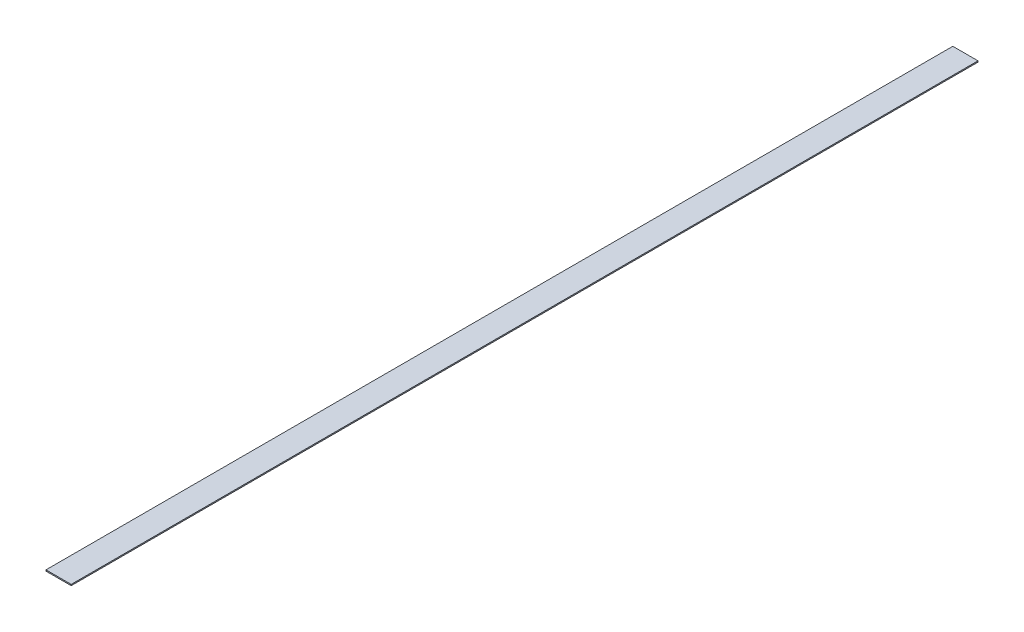
ISO-10303-21;
HEADER;
FILE_DESCRIPTION(('STEP AP214'),'2;1');
FILE_NAME('part.step','',(''),(''),'','','');
FILE_SCHEMA(('AUTOMOTIVE_DESIGN { 1 0 10303 214 1 1 1 1 }'));
ENDSEC;
DATA;
#1=APPLICATION_CONTEXT('core data for automotive mechanical design processes');
#2=APPLICATION_PROTOCOL_DEFINITION('international standard','automotive_design',2000,#1);
#3=PRODUCT_CONTEXT('',#1,'mechanical');
#4=PRODUCT('Part','Part','',(#3));
#5=PRODUCT_RELATED_PRODUCT_CATEGORY('part','',(#4));
#6=PRODUCT_DEFINITION_FORMATION('','',#4);
#7=PRODUCT_DEFINITION_CONTEXT('part definition',#1,'design');
#8=PRODUCT_DEFINITION('design','',#6,#7);
#9=PRODUCT_DEFINITION_SHAPE('','',#8);
#10=(LENGTH_UNIT() NAMED_UNIT(*) SI_UNIT(.MILLI.,.METRE.));
#11=(NAMED_UNIT(*) PLANE_ANGLE_UNIT() SI_UNIT($,.RADIAN.));
#12=(NAMED_UNIT(*) SI_UNIT($,.STERADIAN.) SOLID_ANGLE_UNIT());
#13=UNCERTAINTY_MEASURE_WITH_UNIT(LENGTH_MEASURE(1.E-05),#10,'distance_accuracy_value','');
#14=(GEOMETRIC_REPRESENTATION_CONTEXT(3) GLOBAL_UNCERTAINTY_ASSIGNED_CONTEXT((#13)) GLOBAL_UNIT_ASSIGNED_CONTEXT((#10,
#11,#12)) REPRESENTATION_CONTEXT('',''));
#15=CARTESIAN_POINT('',(0.,0.,0.));
#16=DIRECTION('',(0.,0.,1.));
#17=DIRECTION('',(1.,0.,0.));
#18=AXIS2_PLACEMENT_3D('',#15,#16,#17);
#19=CARTESIAN_POINT('',(-25.4,1.190625,914.4));
#20=DIRECTION('',(1.,0.,0.));
#21=DIRECTION('',(0.,0.,-1.));
#22=AXIS2_PLACEMENT_3D('',#19,#20,#21);
#23=PLANE('',#22);
#24=DIRECTION('',(0.,0.,-1.));
#25=VECTOR('',#24,1.);
#26=CARTESIAN_POINT('',(-25.4,1.190625,914.4));
#27=LINE('',#26,#25);
#28=CARTESIAN_POINT('',(-25.4,1.190625,914.4));
#29=VERTEX_POINT('',#28);
#30=CARTESIAN_POINT('',(-25.4,1.190625,-914.4));
#31=VERTEX_POINT('',#30);
#32=EDGE_CURVE('E89',#29,#31,#27,.T.);
#33=ORIENTED_EDGE('',*,*,#32,.T.);
#34=DIRECTION('',(0.,-1.,0.));
#35=VECTOR('',#34,1.);
#36=CARTESIAN_POINT('',(-25.4,1.190625,-914.4));
#37=LINE('',#36,#35);
#38=CARTESIAN_POINT('',(-25.4,-1.190625,-914.4));
#39=VERTEX_POINT('',#38);
#40=EDGE_CURVE('E84',#31,#39,#37,.T.);
#41=ORIENTED_EDGE('',*,*,#40,.T.);
#42=DIRECTION('',(0.,0.,-1.));
#43=VECTOR('',#42,1.);
#44=CARTESIAN_POINT('',(-25.4,-1.190625,914.4));
#45=LINE('',#44,#43);
#46=CARTESIAN_POINT('',(-25.4,-1.190625,914.4));
#47=VERTEX_POINT('',#46);
#48=EDGE_CURVE('E11',#47,#39,#45,.T.);
#49=ORIENTED_EDGE('',*,*,#48,.F.);
#50=DIRECTION('',(0.,-1.,0.));
#51=VECTOR('',#50,1.);
#52=CARTESIAN_POINT('',(-25.4,1.190625,914.4));
#53=LINE('',#52,#51);
#54=EDGE_CURVE('E95',#29,#47,#53,.T.);
#55=ORIENTED_EDGE('',*,*,#54,.F.);
#56=EDGE_LOOP('',(#33,#41,#49,#55));
#57=FACE_BOUND('',#56,.T.);
#58=ADVANCED_FACE('F32',(#57),#23,.F.);
#59=CARTESIAN_POINT('',(25.4,-1.190625,914.4));
#60=DIRECTION('',(0.,1.,0.));
#61=DIRECTION('',(0.,0.,1.));
#62=AXIS2_PLACEMENT_3D('',#59,#60,#61);
#63=PLANE('',#62);
#64=ORIENTED_EDGE('',*,*,#48,.T.);
#65=DIRECTION('',(1.,0.,0.));
#66=VECTOR('',#65,1.);
#67=CARTESIAN_POINT('',(25.4,-1.190625,-914.4));
#68=LINE('',#67,#66);
#69=CARTESIAN_POINT('',(25.4,-1.190625,-914.4));
#70=VERTEX_POINT('',#69);
#71=EDGE_CURVE('E74',#39,#70,#68,.T.);
#72=ORIENTED_EDGE('',*,*,#71,.T.);
#73=DIRECTION('',(0.,0.,-1.));
#74=VECTOR('',#73,1.);
#75=CARTESIAN_POINT('',(25.4,-1.190625,914.4));
#76=LINE('',#75,#74);
#77=CARTESIAN_POINT('',(25.4,-1.190625,914.4));
#78=VERTEX_POINT('',#77);
#79=EDGE_CURVE('E39',#78,#70,#76,.T.);
#80=ORIENTED_EDGE('',*,*,#79,.F.);
#81=DIRECTION('',(1.,0.,0.));
#82=VECTOR('',#81,1.);
#83=CARTESIAN_POINT('',(25.4,-1.190625,914.4));
#84=LINE('',#83,#82);
#85=EDGE_CURVE('E75',#47,#78,#84,.T.);
#86=ORIENTED_EDGE('',*,*,#85,.F.);
#87=EDGE_LOOP('',(#64,#72,#80,#86));
#88=FACE_BOUND('',#87,.T.);
#89=ADVANCED_FACE('F72',(#88),#63,.F.);
#90=CARTESIAN_POINT('',(25.4,1.190625,914.4));
#91=DIRECTION('',(-1.,0.,0.));
#92=DIRECTION('',(0.,0.,1.));
#93=AXIS2_PLACEMENT_3D('',#90,#91,#92);
#94=PLANE('',#93);
#95=ORIENTED_EDGE('',*,*,#79,.T.);
#96=DIRECTION('',(0.,1.,0.));
#97=VECTOR('',#96,1.);
#98=CARTESIAN_POINT('',(25.4,1.190625,-914.4));
#99=LINE('',#98,#97);
#100=CARTESIAN_POINT('',(25.4,1.190625,-914.4));
#101=VERTEX_POINT('',#100);
#102=EDGE_CURVE('E87',#70,#101,#99,.T.);
#103=ORIENTED_EDGE('',*,*,#102,.T.);
#104=DIRECTION('',(0.,0.,-1.));
#105=VECTOR('',#104,1.);
#106=CARTESIAN_POINT('',(25.4,1.190625,914.4));
#107=LINE('',#106,#105);
#108=CARTESIAN_POINT('',(25.4,1.190625,914.4));
#109=VERTEX_POINT('',#108);
#110=EDGE_CURVE('E101',#109,#101,#107,.T.);
#111=ORIENTED_EDGE('',*,*,#110,.F.);
#112=DIRECTION('',(0.,1.,0.));
#113=VECTOR('',#112,1.);
#114=CARTESIAN_POINT('',(25.4,1.190625,914.4));
#115=LINE('',#114,#113);
#116=EDGE_CURVE('E51',#78,#109,#115,.T.);
#117=ORIENTED_EDGE('',*,*,#116,.F.);
#118=EDGE_LOOP('',(#95,#103,#111,#117));
#119=FACE_BOUND('',#118,.T.);
#120=ADVANCED_FACE('F103',(#119),#94,.F.);
#121=CARTESIAN_POINT('',(25.4,1.190625,914.4));
#122=DIRECTION('',(0.,-1.,0.));
#123=DIRECTION('',(0.,0.,-1.));
#124=AXIS2_PLACEMENT_3D('',#121,#122,#123);
#125=PLANE('',#124);
#126=ORIENTED_EDGE('',*,*,#110,.T.);
#127=DIRECTION('',(-1.,0.,0.));
#128=VECTOR('',#127,1.);
#129=CARTESIAN_POINT('',(25.4,1.190625,-914.4));
#130=LINE('',#129,#128);
#131=EDGE_CURVE('E93',#101,#31,#130,.T.);
#132=ORIENTED_EDGE('',*,*,#131,.T.);
#133=ORIENTED_EDGE('',*,*,#32,.F.);
#134=DIRECTION('',(-1.,0.,0.));
#135=VECTOR('',#134,1.);
#136=CARTESIAN_POINT('',(25.4,1.190625,914.4));
#137=LINE('',#136,#135);
#138=EDGE_CURVE('E46',#109,#29,#137,.T.);
#139=ORIENTED_EDGE('',*,*,#138,.F.);
#140=EDGE_LOOP('',(#126,#132,#133,#139));
#141=FACE_BOUND('',#140,.T.);
#142=ADVANCED_FACE('F105',(#141),#125,.F.);
#143=CARTESIAN_POINT('',(0.,0.,914.4));
#144=DIRECTION('',(0.,0.,-1.));
#145=DIRECTION('',(-1.,0.,0.));
#146=AXIS2_PLACEMENT_3D('',#143,#144,#145);
#147=PLANE('',#146);
#148=ORIENTED_EDGE('',*,*,#54,.T.);
#149=ORIENTED_EDGE('',*,*,#85,.T.);
#150=ORIENTED_EDGE('',*,*,#116,.T.);
#151=ORIENTED_EDGE('',*,*,#138,.T.);
#152=EDGE_LOOP('',(#148,#149,#150,#151));
#153=FACE_BOUND('',#152,.T.);
#154=ADVANCED_FACE('F106',(#153),#147,.F.);
#155=CARTESIAN_POINT('',(0.,0.,-914.4));
#156=DIRECTION('',(0.,0.,-1.));
#157=DIRECTION('',(-1.,0.,0.));
#158=AXIS2_PLACEMENT_3D('',#155,#156,#157);
#159=PLANE('',#158);
#160=ORIENTED_EDGE('',*,*,#40,.F.);
#161=ORIENTED_EDGE('',*,*,#131,.F.);
#162=ORIENTED_EDGE('',*,*,#102,.F.);
#163=ORIENTED_EDGE('',*,*,#71,.F.);
#164=EDGE_LOOP('',(#160,#161,#162,#163));
#165=FACE_BOUND('',#164,.T.);
#166=ADVANCED_FACE('F82',(#165),#159,.T.);
#167=CLOSED_SHELL('',(#58,#89,#120,#142,#154,#166));
#168=MANIFOLD_SOLID_BREP('B2',#167);
#169=ADVANCED_BREP_SHAPE_REPRESENTATION('',(#18,#168),#14);
#170=SHAPE_DEFINITION_REPRESENTATION(#9,#169);
ENDSEC;
END-ISO-10303-21;
